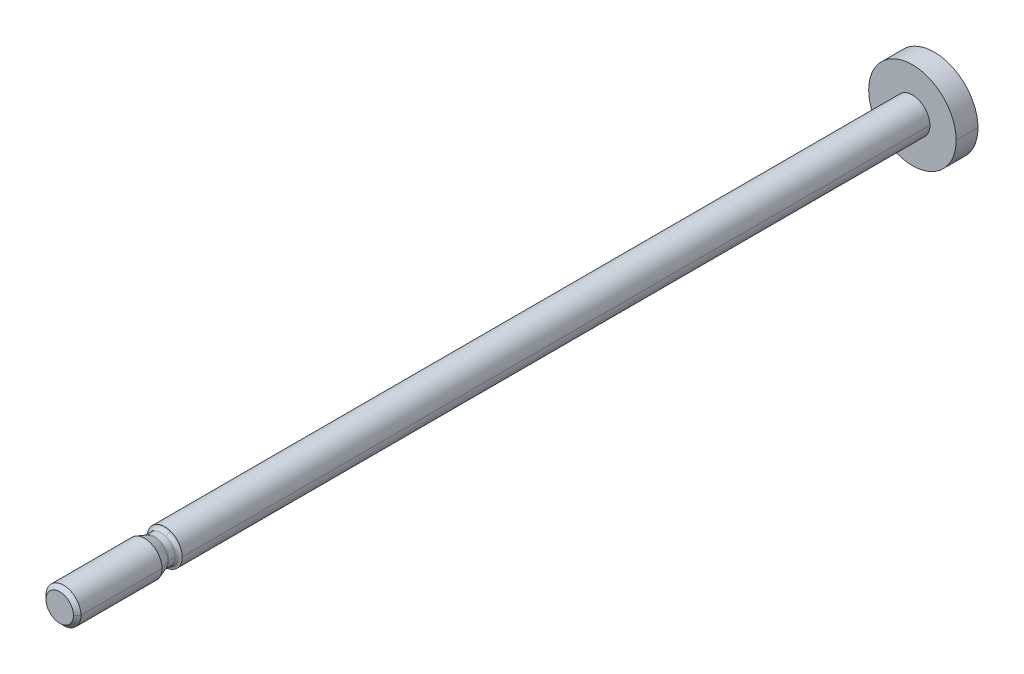
ISO-10303-21;
HEADER;
FILE_DESCRIPTION(('STEP AP214'),'2;1');
FILE_NAME('part.step','',(''),(''),'','','');
FILE_SCHEMA(('AUTOMOTIVE_DESIGN { 1 0 10303 214 1 1 1 1 }'));
ENDSEC;
DATA;
#1=APPLICATION_CONTEXT('core data for automotive mechanical design processes');
#2=APPLICATION_PROTOCOL_DEFINITION('international standard','automotive_design',2000,#1);
#3=PRODUCT_CONTEXT('',#1,'mechanical');
#4=PRODUCT('Part','Part','',(#3));
#5=PRODUCT_RELATED_PRODUCT_CATEGORY('part','',(#4));
#6=PRODUCT_DEFINITION_FORMATION('','',#4);
#7=PRODUCT_DEFINITION_CONTEXT('part definition',#1,'design');
#8=PRODUCT_DEFINITION('design','',#6,#7);
#9=PRODUCT_DEFINITION_SHAPE('','',#8);
#10=(LENGTH_UNIT() NAMED_UNIT(*) SI_UNIT(.MILLI.,.METRE.));
#11=(NAMED_UNIT(*) PLANE_ANGLE_UNIT() SI_UNIT($,.RADIAN.));
#12=(NAMED_UNIT(*) SI_UNIT($,.STERADIAN.) SOLID_ANGLE_UNIT());
#13=UNCERTAINTY_MEASURE_WITH_UNIT(LENGTH_MEASURE(1.E-05),#10,'distance_accuracy_value','');
#14=(GEOMETRIC_REPRESENTATION_CONTEXT(3) GLOBAL_UNCERTAINTY_ASSIGNED_CONTEXT((#13)) GLOBAL_UNIT_ASSIGNED_CONTEXT((#10,
#11,#12)) REPRESENTATION_CONTEXT('',''));
#15=CARTESIAN_POINT('',(0.,0.,0.));
#16=DIRECTION('',(0.,0.,1.));
#17=DIRECTION('',(1.,0.,0.));
#18=AXIS2_PLACEMENT_3D('',#15,#16,#17);
#19=CARTESIAN_POINT('',(0.,0.,-84.));
#20=DIRECTION('',(0.,0.,-1.));
#21=DIRECTION('',(0.,1.,0.));
#22=AXIS2_PLACEMENT_3D('',#19,#20,#21);
#23=CYLINDRICAL_SURFACE('',#22,2.);
#24=DIRECTION('',(0.,0.,-1.));
#25=VECTOR('',#24,1.);
#26=CARTESIAN_POINT('',(2.,0.,4.));
#27=LINE('',#26,#25);
#28=CARTESIAN_POINT('',(2.,0.,4.));
#29=VERTEX_POINT('',#28);
#30=CARTESIAN_POINT('',(2.,0.,-81.5));
#31=VERTEX_POINT('',#30);
#32=EDGE_CURVE('E11',#29,#31,#27,.T.);
#33=ORIENTED_EDGE('',*,*,#32,.F.);
#34=CARTESIAN_POINT('',(0.,0.,4.));
#35=DIRECTION('',(0.,0.,-1.));
#36=DIRECTION('',(-1.,0.,0.));
#37=AXIS2_PLACEMENT_3D('',#34,#35,#36);
#38=CIRCLE('',#37,2.);
#39=CARTESIAN_POINT('',(-0.618033988749915,-1.90211303259037,4.));
#40=VERTEX_POINT('',#39);
#41=EDGE_CURVE('E24',#29,#40,#38,.T.);
#42=ORIENTED_EDGE('',*,*,#41,.T.);
#43=CARTESIAN_POINT('',(0.,0.,4.));
#44=DIRECTION('',(0.,0.,-1.));
#45=DIRECTION('',(-1.,0.,0.));
#46=AXIS2_PLACEMENT_3D('',#43,#44,#45);
#47=CIRCLE('',#46,2.);
#48=CARTESIAN_POINT('',(-2.,0.,4.));
#49=VERTEX_POINT('',#48);
#50=EDGE_CURVE('E306',#40,#49,#47,.T.);
#51=ORIENTED_EDGE('',*,*,#50,.T.);
#52=DIRECTION('',(0.,0.,-1.));
#53=VECTOR('',#52,1.);
#54=CARTESIAN_POINT('',(-2.,0.,4.));
#55=LINE('',#54,#53);
#56=CARTESIAN_POINT('',(-2.,0.,-81.5));
#57=VERTEX_POINT('',#56);
#58=EDGE_CURVE('E302',#49,#57,#55,.T.);
#59=ORIENTED_EDGE('',*,*,#58,.T.);
#60=CARTESIAN_POINT('',(0.,0.,-81.5));
#61=DIRECTION('',(0.,0.,-1.));
#62=DIRECTION('',(-1.,0.,0.));
#63=AXIS2_PLACEMENT_3D('',#60,#61,#62);
#64=CIRCLE('',#63,2.);
#65=EDGE_CURVE('E297',#31,#57,#64,.T.);
#66=ORIENTED_EDGE('',*,*,#65,.F.);
#67=EDGE_LOOP('',(#33,#42,#51,#59,#66));
#68=FACE_BOUND('',#67,.T.);
#69=ADVANCED_FACE('F16',(#68),#23,.T.);
#70=CARTESIAN_POINT('',(0.,2.,-81.5));
#71=DIRECTION('',(0.,0.,-1.));
#72=DIRECTION('',(-1.,0.,0.));
#73=AXIS2_PLACEMENT_3D('',#70,#71,#72);
#74=PLANE('',#73);
#75=CARTESIAN_POINT('',(0.,0.,-81.5));
#76=DIRECTION('',(0.,0.,-1.));
#77=DIRECTION('',(-1.,0.,0.));
#78=AXIS2_PLACEMENT_3D('',#75,#76,#77);
#79=CIRCLE('',#78,5.);
#80=CARTESIAN_POINT('',(5.,0.,-81.5));
#81=VERTEX_POINT('',#80);
#82=CARTESIAN_POINT('',(-5.,0.,-81.5));
#83=VERTEX_POINT('',#82);
#84=EDGE_CURVE('E128',#81,#83,#79,.T.);
#85=ORIENTED_EDGE('',*,*,#84,.F.);
#86=CARTESIAN_POINT('',(0.,0.,-81.5));
#87=DIRECTION('',(0.,0.,-1.));
#88=DIRECTION('',(-1.,0.,0.));
#89=AXIS2_PLACEMENT_3D('',#86,#87,#88);
#90=CIRCLE('',#89,5.);
#91=EDGE_CURVE('E290',#83,#81,#90,.T.);
#92=ORIENTED_EDGE('',*,*,#91,.F.);
#93=EDGE_LOOP('',(#85,#92));
#94=FACE_BOUND('',#93,.T.);
#95=CARTESIAN_POINT('',(0.,0.,-81.5));
#96=DIRECTION('',(0.,0.,-1.));
#97=DIRECTION('',(-1.,0.,0.));
#98=AXIS2_PLACEMENT_3D('',#95,#96,#97);
#99=CIRCLE('',#98,2.);
#100=EDGE_CURVE('E285',#57,#31,#99,.T.);
#101=ORIENTED_EDGE('',*,*,#100,.T.);
#102=ORIENTED_EDGE('',*,*,#65,.T.);
#103=EDGE_LOOP('',(#101,#102));
#104=FACE_BOUND('',#103,.T.);
#105=ADVANCED_FACE('F325',(#94,#104),#74,.F.);
#106=CARTESIAN_POINT('',(0.,0.,-84.));
#107=DIRECTION('',(0.,0.,-1.));
#108=DIRECTION('',(0.,-1.,0.));
#109=AXIS2_PLACEMENT_3D('',#106,#107,#108);
#110=CYLINDRICAL_SURFACE('',#109,2.);
#111=ORIENTED_EDGE('',*,*,#32,.T.);
#112=ORIENTED_EDGE('',*,*,#100,.F.);
#113=ORIENTED_EDGE('',*,*,#58,.F.);
#114=CARTESIAN_POINT('',(0.,0.,4.));
#115=DIRECTION('',(0.,0.,-1.));
#116=DIRECTION('',(-1.,0.,0.));
#117=AXIS2_PLACEMENT_3D('',#114,#115,#116);
#118=CIRCLE('',#117,2.);
#119=CARTESIAN_POINT('',(0.618033988749915,1.90211303259037,4.));
#120=VERTEX_POINT('',#119);
#121=EDGE_CURVE('E281',#49,#120,#118,.T.);
#122=ORIENTED_EDGE('',*,*,#121,.T.);
#123=CARTESIAN_POINT('',(0.,0.,4.));
#124=DIRECTION('',(0.,0.,-1.));
#125=DIRECTION('',(-1.,0.,0.));
#126=AXIS2_PLACEMENT_3D('',#123,#124,#125);
#127=CIRCLE('',#126,2.);
#128=EDGE_CURVE('E277',#120,#29,#127,.T.);
#129=ORIENTED_EDGE('',*,*,#128,.T.);
#130=EDGE_LOOP('',(#111,#112,#113,#122,#129));
#131=FACE_BOUND('',#130,.T.);
#132=ADVANCED_FACE('F323',(#131),#110,.T.);
#133=CARTESIAN_POINT('',(0.,0.,4.40000000000007));
#134=DIRECTION('',(0.,0.,-1.));
#135=DIRECTION('',(-0.951056516295154,0.309016994374947,0.));
#136=AXIS2_PLACEMENT_3D('',#133,#134,#135);
#137=TOROIDAL_SURFACE('',#136,2.00000000000007,0.400000000000064);
#138=CARTESIAN_POINT('',(-0.618033988749915,-1.90211303259037,4.40000000000007));
#139=DIRECTION('',(-0.951056516295154,0.309016994374947,0.));
#140=DIRECTION('',(0.309016994374947,0.951056516295154,-1.64313007644497E-13));
#141=AXIS2_PLACEMENT_3D('',#138,#139,#140);
#142=CIRCLE('',#141,0.400000000000064);
#143=CARTESIAN_POINT('',(-0.494427190999916,-1.52169042607225,4.4));
#144=VERTEX_POINT('',#143);
#145=EDGE_CURVE('E273',#144,#40,#142,.T.);
#146=ORIENTED_EDGE('',*,*,#145,.T.);
#147=ORIENTED_EDGE('',*,*,#41,.F.);
#148=ORIENTED_EDGE('',*,*,#128,.F.);
#149=CARTESIAN_POINT('',(0.618033988749915,1.90211303259037,4.40000000000007));
#150=DIRECTION('',(0.951056516295154,-0.309016994374947,0.));
#151=DIRECTION('',(-0.309016994374947,-0.951056516295154,-1.64313007644497E-13));
#152=AXIS2_PLACEMENT_3D('',#149,#150,#151);
#153=CIRCLE('',#152,0.400000000000064);
#154=CARTESIAN_POINT('',(0.494427190999916,1.52169042607225,4.4));
#155=VERTEX_POINT('',#154);
#156=EDGE_CURVE('E268',#155,#120,#153,.T.);
#157=ORIENTED_EDGE('',*,*,#156,.F.);
#158=CARTESIAN_POINT('',(0.,0.,4.4));
#159=DIRECTION('',(0.,0.,-1.));
#160=DIRECTION('',(-1.,0.,0.));
#161=AXIS2_PLACEMENT_3D('',#158,#159,#160);
#162=CIRCLE('',#161,1.6);
#163=CARTESIAN_POINT('',(1.6,0.,4.4));
#164=VERTEX_POINT('',#163);
#165=EDGE_CURVE('E264',#155,#164,#162,.T.);
#166=ORIENTED_EDGE('',*,*,#165,.T.);
#167=CARTESIAN_POINT('',(0.,0.,4.4));
#168=DIRECTION('',(0.,0.,-1.));
#169=DIRECTION('',(-1.,0.,0.));
#170=AXIS2_PLACEMENT_3D('',#167,#168,#169);
#171=CIRCLE('',#170,1.6);
#172=EDGE_CURVE('E260',#164,#144,#171,.T.);
#173=ORIENTED_EDGE('',*,*,#172,.T.);
#174=EDGE_LOOP('',(#146,#147,#148,#157,#166,#173));
#175=FACE_BOUND('',#174,.T.);
#176=ADVANCED_FACE('F333',(#175),#137,.F.);
#177=CARTESIAN_POINT('',(0.,0.,3.));
#178=DIRECTION('',(0.,0.,-1.));
#179=DIRECTION('',(0.,1.,0.));
#180=AXIS2_PLACEMENT_3D('',#177,#178,#179);
#181=CYLINDRICAL_SURFACE('',#180,1.6);
#182=DIRECTION('',(0.,0.,-1.));
#183=VECTOR('',#182,1.);
#184=CARTESIAN_POINT('',(1.6,0.,5.1294692077166));
#185=LINE('',#184,#183);
#186=CARTESIAN_POINT('',(1.6,0.,5.1294692077166));
#187=VERTEX_POINT('',#186);
#188=EDGE_CURVE('E255',#187,#164,#185,.T.);
#189=ORIENTED_EDGE('',*,*,#188,.F.);
#190=CARTESIAN_POINT('',(0.,0.,5.1294692077166));
#191=DIRECTION('',(0.,0.,-1.));
#192=DIRECTION('',(-1.,0.,0.));
#193=AXIS2_PLACEMENT_3D('',#190,#191,#192);
#194=CIRCLE('',#193,1.6);
#195=CARTESIAN_POINT('',(-0.494427190999915,-1.52169042607224,5.1294692077166));
#196=VERTEX_POINT('',#195);
#197=EDGE_CURVE('E251',#187,#196,#194,.T.);
#198=ORIENTED_EDGE('',*,*,#197,.T.);
#199=CARTESIAN_POINT('',(0.,0.,5.1294692077166));
#200=DIRECTION('',(0.,0.,-1.));
#201=DIRECTION('',(-1.,0.,0.));
#202=AXIS2_PLACEMENT_3D('',#199,#200,#201);
#203=CIRCLE('',#202,1.6);
#204=CARTESIAN_POINT('',(-1.6,0.,5.1294692077166));
#205=VERTEX_POINT('',#204);
#206=EDGE_CURVE('E247',#196,#205,#203,.T.);
#207=ORIENTED_EDGE('',*,*,#206,.T.);
#208=DIRECTION('',(0.,0.,-1.));
#209=VECTOR('',#208,1.);
#210=CARTESIAN_POINT('',(-1.6,0.,5.1294692077166));
#211=LINE('',#210,#209);
#212=CARTESIAN_POINT('',(-1.6,0.,4.4));
#213=VERTEX_POINT('',#212);
#214=EDGE_CURVE('E243',#205,#213,#211,.T.);
#215=ORIENTED_EDGE('',*,*,#214,.T.);
#216=CARTESIAN_POINT('',(0.,0.,4.4));
#217=DIRECTION('',(0.,0.,-1.));
#218=DIRECTION('',(-1.,0.,0.));
#219=AXIS2_PLACEMENT_3D('',#216,#217,#218);
#220=CIRCLE('',#219,1.6);
#221=EDGE_CURVE('E238',#144,#213,#220,.T.);
#222=ORIENTED_EDGE('',*,*,#221,.F.);
#223=ORIENTED_EDGE('',*,*,#172,.F.);
#224=EDGE_LOOP('',(#189,#198,#207,#215,#222,#223));
#225=FACE_BOUND('',#224,.T.);
#226=ADVANCED_FACE('F338',(#225),#181,.T.);
#227=CARTESIAN_POINT('',(0.,0.,4.40000000000007));
#228=DIRECTION('',(0.,0.,-1.));
#229=DIRECTION('',(0.951056516295154,-0.309016994374947,0.));
#230=AXIS2_PLACEMENT_3D('',#227,#228,#229);
#231=TOROIDAL_SURFACE('',#230,2.00000000000007,0.400000000000064);
#232=ORIENTED_EDGE('',*,*,#145,.F.);
#233=ORIENTED_EDGE('',*,*,#221,.T.);
#234=CARTESIAN_POINT('',(0.,0.,4.4));
#235=DIRECTION('',(0.,0.,-1.));
#236=DIRECTION('',(-1.,0.,0.));
#237=AXIS2_PLACEMENT_3D('',#234,#235,#236);
#238=CIRCLE('',#237,1.6);
#239=EDGE_CURVE('E233',#213,#155,#238,.T.);
#240=ORIENTED_EDGE('',*,*,#239,.T.);
#241=ORIENTED_EDGE('',*,*,#156,.T.);
#242=ORIENTED_EDGE('',*,*,#121,.F.);
#243=ORIENTED_EDGE('',*,*,#50,.F.);
#244=EDGE_LOOP('',(#232,#233,#240,#241,#242,#243));
#245=FACE_BOUND('',#244,.T.);
#246=ADVANCED_FACE('F320',(#245),#231,.F.);
#247=CARTESIAN_POINT('',(0.,0.,3.));
#248=DIRECTION('',(0.,0.,-1.));
#249=DIRECTION('',(0.,-1.,0.));
#250=AXIS2_PLACEMENT_3D('',#247,#248,#249);
#251=CYLINDRICAL_SURFACE('',#250,1.6);
#252=ORIENTED_EDGE('',*,*,#188,.T.);
#253=ORIENTED_EDGE('',*,*,#165,.F.);
#254=ORIENTED_EDGE('',*,*,#239,.F.);
#255=ORIENTED_EDGE('',*,*,#214,.F.);
#256=CARTESIAN_POINT('',(0.,0.,5.1294692077166));
#257=DIRECTION('',(0.,0.,-1.));
#258=DIRECTION('',(-1.,0.,0.));
#259=AXIS2_PLACEMENT_3D('',#256,#257,#258);
#260=CIRCLE('',#259,1.6);
#261=CARTESIAN_POINT('',(0.494427190999915,1.52169042607224,5.1294692077166));
#262=VERTEX_POINT('',#261);
#263=EDGE_CURVE('E229',#205,#262,#260,.T.);
#264=ORIENTED_EDGE('',*,*,#263,.T.);
#265=CARTESIAN_POINT('',(0.,0.,5.1294692077166));
#266=DIRECTION('',(0.,0.,-1.));
#267=DIRECTION('',(-1.,0.,0.));
#268=AXIS2_PLACEMENT_3D('',#265,#266,#267);
#269=CIRCLE('',#268,1.6);
#270=EDGE_CURVE('E224',#262,#187,#269,.T.);
#271=ORIENTED_EDGE('',*,*,#270,.T.);
#272=EDGE_LOOP('',(#252,#253,#254,#255,#264,#271));
#273=FACE_BOUND('',#272,.T.);
#274=ADVANCED_FACE('F345',(#273),#251,.T.);
#275=CARTESIAN_POINT('',(0.,0.,5.12946920771672));
#276=DIRECTION('',(0.,0.,-1.));
#277=DIRECTION('',(-0.951056516295154,0.309016994374947,0.));
#278=AXIS2_PLACEMENT_3D('',#275,#276,#277);
#279=TOROIDAL_SURFACE('',#278,2.0000000000001,0.400000000000107);
#280=CARTESIAN_POINT('',(-0.618033988749927,-1.90211303259041,5.12946920771672));
#281=DIRECTION('',(-0.951056516295154,0.309016994374947,0.));
#282=DIRECTION('',(0.290380989311613,0.893700790313016,0.342020143325361));
#283=AXIS2_PLACEMENT_3D('',#280,#281,#282);
#284=CIRCLE('',#283,0.400000000000107);
#285=CARTESIAN_POINT('',(-0.50188159302525,-1.54463271646511,5.2662772650469));
#286=VERTEX_POINT('',#285);
#287=EDGE_CURVE('E219',#286,#196,#284,.T.);
#288=ORIENTED_EDGE('',*,*,#287,.T.);
#289=ORIENTED_EDGE('',*,*,#197,.F.);
#290=ORIENTED_EDGE('',*,*,#270,.F.);
#291=CARTESIAN_POINT('',(0.618033988749927,1.90211303259041,5.12946920771672));
#292=DIRECTION('',(0.951056516295154,-0.309016994374948,0.));
#293=DIRECTION('',(-0.290380989311613,-0.893700790313016,0.342020143325361));
#294=AXIS2_PLACEMENT_3D('',#291,#292,#293);
#295=CIRCLE('',#294,0.400000000000107);
#296=CARTESIAN_POINT('',(0.501881593025251,1.54463271646511,5.2662772650469));
#297=VERTEX_POINT('',#296);
#298=EDGE_CURVE('E214',#297,#262,#295,.T.);
#299=ORIENTED_EDGE('',*,*,#298,.F.);
#300=CARTESIAN_POINT('',(0.,0.,5.2662772650469));
#301=DIRECTION('',(0.,0.,-1.));
#302=DIRECTION('',(-1.,0.,0.));
#303=AXIS2_PLACEMENT_3D('',#300,#301,#302);
#304=CIRCLE('',#303,1.6241229516856);
#305=CARTESIAN_POINT('',(1.6241229516856,0.,5.2662772650469));
#306=VERTEX_POINT('',#305);
#307=EDGE_CURVE('E210',#297,#306,#304,.T.);
#308=ORIENTED_EDGE('',*,*,#307,.T.);
#309=CARTESIAN_POINT('',(0.,0.,5.2662772650469));
#310=DIRECTION('',(0.,0.,-1.));
#311=DIRECTION('',(-1.,0.,0.));
#312=AXIS2_PLACEMENT_3D('',#309,#310,#311);
#313=CIRCLE('',#312,1.6241229516856);
#314=EDGE_CURVE('E206',#306,#286,#313,.T.);
#315=ORIENTED_EDGE('',*,*,#314,.T.);
#316=EDGE_LOOP('',(#288,#289,#290,#299,#308,#315));
#317=FACE_BOUND('',#316,.T.);
#318=ADVANCED_FACE('F348',(#317),#279,.F.);
#319=CARTESIAN_POINT('',(0.,0.,6.2989909677818));
#320=DIRECTION('',(0.,0.,1.));
#321=DIRECTION('',(0.,1.,0.));
#322=AXIS2_PLACEMENT_3D('',#319,#320,#321);
#323=CONICAL_SURFACE('',#322,2.,0.349065850398918);
#324=DIRECTION('',(-0.342020143325717,0.,0.939692620785891));
#325=VECTOR('',#324,1.);
#326=CARTESIAN_POINT('',(-1.6241229516856,0.,5.2662772650469));
#327=LINE('',#326,#325);
#328=CARTESIAN_POINT('',(-1.6241229516856,0.,5.2662772650469));
#329=VERTEX_POINT('',#328);
#330=CARTESIAN_POINT('',(-2.,0.,6.2989909677818));
#331=VERTEX_POINT('',#330);
#332=EDGE_CURVE('E201',#329,#331,#327,.T.);
#333=ORIENTED_EDGE('',*,*,#332,.F.);
#334=CARTESIAN_POINT('',(0.,0.,5.2662772650469));
#335=DIRECTION('',(0.,0.,-1.));
#336=DIRECTION('',(-1.,0.,0.));
#337=AXIS2_PLACEMENT_3D('',#334,#335,#336);
#338=CIRCLE('',#337,1.6241229516856);
#339=EDGE_CURVE('E196',#286,#329,#338,.T.);
#340=ORIENTED_EDGE('',*,*,#339,.F.);
#341=ORIENTED_EDGE('',*,*,#314,.F.);
#342=DIRECTION('',(0.342020143325717,0.,0.939692620785891));
#343=VECTOR('',#342,1.);
#344=CARTESIAN_POINT('',(1.6241229516856,0.,5.2662772650469));
#345=LINE('',#344,#343);
#346=CARTESIAN_POINT('',(2.,0.,6.2989909677818));
#347=VERTEX_POINT('',#346);
#348=EDGE_CURVE('E192',#306,#347,#345,.T.);
#349=ORIENTED_EDGE('',*,*,#348,.T.);
#350=CARTESIAN_POINT('',(0.,0.,6.2989909677818));
#351=DIRECTION('',(0.,0.,-1.));
#352=DIRECTION('',(-1.,0.,0.));
#353=AXIS2_PLACEMENT_3D('',#350,#351,#352);
#354=CIRCLE('',#353,2.);
#355=EDGE_CURVE('E188',#347,#331,#354,.T.);
#356=ORIENTED_EDGE('',*,*,#355,.T.);
#357=EDGE_LOOP('',(#333,#340,#341,#349,#356));
#358=FACE_BOUND('',#357,.T.);
#359=ADVANCED_FACE('F352',(#358),#323,.T.);
#360=CARTESIAN_POINT('',(0.,0.,3.));
#361=DIRECTION('',(0.,0.,-1.));
#362=DIRECTION('',(0.,1.,0.));
#363=AXIS2_PLACEMENT_3D('',#360,#361,#362);
#364=CYLINDRICAL_SURFACE('',#363,2.);
#365=DIRECTION('',(0.,0.,-1.));
#366=VECTOR('',#365,1.);
#367=CARTESIAN_POINT('',(2.,0.,15.5705));
#368=LINE('',#367,#366);
#369=CARTESIAN_POINT('',(2.,0.,15.5705));
#370=VERTEX_POINT('',#369);
#371=EDGE_CURVE('E183',#370,#347,#368,.T.);
#372=ORIENTED_EDGE('',*,*,#371,.F.);
#373=CARTESIAN_POINT('',(0.,0.,15.5705));
#374=DIRECTION('',(0.,0.,-1.));
#375=DIRECTION('',(-1.,0.,0.));
#376=AXIS2_PLACEMENT_3D('',#373,#374,#375);
#377=CIRCLE('',#376,2.);
#378=CARTESIAN_POINT('',(-2.,0.,15.5705));
#379=VERTEX_POINT('',#378);
#380=EDGE_CURVE('E179',#370,#379,#377,.T.);
#381=ORIENTED_EDGE('',*,*,#380,.T.);
#382=DIRECTION('',(0.,0.,-1.));
#383=VECTOR('',#382,1.);
#384=CARTESIAN_POINT('',(-2.,0.,15.5705));
#385=LINE('',#384,#383);
#386=EDGE_CURVE('E174',#379,#331,#385,.T.);
#387=ORIENTED_EDGE('',*,*,#386,.T.);
#388=ORIENTED_EDGE('',*,*,#355,.F.);
#389=EDGE_LOOP('',(#372,#381,#387,#388));
#390=FACE_BOUND('',#389,.T.);
#391=ADVANCED_FACE('F356',(#390),#364,.T.);
#392=CARTESIAN_POINT('',(0.,0.,3.));
#393=DIRECTION('',(0.,0.,-1.));
#394=DIRECTION('',(0.,-1.,0.));
#395=AXIS2_PLACEMENT_3D('',#392,#393,#394);
#396=CYLINDRICAL_SURFACE('',#395,2.);
#397=ORIENTED_EDGE('',*,*,#371,.T.);
#398=CARTESIAN_POINT('',(0.,0.,6.2989909677818));
#399=DIRECTION('',(0.,0.,-1.));
#400=DIRECTION('',(-1.,0.,0.));
#401=AXIS2_PLACEMENT_3D('',#398,#399,#400);
#402=CIRCLE('',#401,2.);
#403=EDGE_CURVE('E169',#331,#347,#402,.T.);
#404=ORIENTED_EDGE('',*,*,#403,.F.);
#405=ORIENTED_EDGE('',*,*,#386,.F.);
#406=CARTESIAN_POINT('',(0.,0.,15.5705));
#407=DIRECTION('',(0.,0.,-1.));
#408=DIRECTION('',(-1.,0.,0.));
#409=AXIS2_PLACEMENT_3D('',#406,#407,#408);
#410=CIRCLE('',#409,2.);
#411=EDGE_CURVE('E164',#379,#370,#410,.T.);
#412=ORIENTED_EDGE('',*,*,#411,.T.);
#413=EDGE_LOOP('',(#397,#404,#405,#412));
#414=FACE_BOUND('',#413,.T.);
#415=ADVANCED_FACE('F360',(#414),#396,.T.);
#416=CARTESIAN_POINT('',(0.,0.,16.));
#417=DIRECTION('',(0.,0.,-1.));
#418=DIRECTION('',(0.,-1.,0.));
#419=AXIS2_PLACEMENT_3D('',#416,#417,#418);
#420=CONICAL_SURFACE('',#419,1.5705,0.785398163397445);
#421=DIRECTION('',(0.707106781186545,0.,-0.70710678118655));
#422=VECTOR('',#421,1.);
#423=CARTESIAN_POINT('',(1.5705,0.,16.));
#424=LINE('',#423,#422);
#425=CARTESIAN_POINT('',(1.5705,0.,16.));
#426=VERTEX_POINT('',#425);
#427=EDGE_CURVE('E159',#426,#370,#424,.T.);
#428=ORIENTED_EDGE('',*,*,#427,.T.);
#429=ORIENTED_EDGE('',*,*,#411,.F.);
#430=DIRECTION('',(-0.707106781186545,0.,-0.70710678118655));
#431=VECTOR('',#430,1.);
#432=CARTESIAN_POINT('',(-1.5705,0.,16.));
#433=LINE('',#432,#431);
#434=CARTESIAN_POINT('',(-1.5705,0.,16.));
#435=VERTEX_POINT('',#434);
#436=EDGE_CURVE('E154',#435,#379,#433,.T.);
#437=ORIENTED_EDGE('',*,*,#436,.F.);
#438=CARTESIAN_POINT('',(0.,0.,16.));
#439=DIRECTION('',(0.,0.,-1.));
#440=DIRECTION('',(-1.,0.,0.));
#441=AXIS2_PLACEMENT_3D('',#438,#439,#440);
#442=CIRCLE('',#441,1.5705);
#443=EDGE_CURVE('E150',#435,#426,#442,.T.);
#444=ORIENTED_EDGE('',*,*,#443,.T.);
#445=EDGE_LOOP('',(#428,#429,#437,#444));
#446=FACE_BOUND('',#445,.T.);
#447=ADVANCED_FACE('F364',(#446),#420,.T.);
#448=CARTESIAN_POINT('',(0.,0.,16.));
#449=DIRECTION('',(0.,0.,-1.));
#450=DIRECTION('',(-1.,0.,0.));
#451=AXIS2_PLACEMENT_3D('',#448,#449,#450);
#452=PLANE('',#451);
#453=CARTESIAN_POINT('',(0.,0.,16.));
#454=DIRECTION('',(0.,0.,-1.));
#455=DIRECTION('',(-1.,0.,0.));
#456=AXIS2_PLACEMENT_3D('',#453,#454,#455);
#457=CIRCLE('',#456,1.5705);
#458=EDGE_CURVE('E145',#426,#435,#457,.T.);
#459=ORIENTED_EDGE('',*,*,#458,.F.);
#460=ORIENTED_EDGE('',*,*,#443,.F.);
#461=EDGE_LOOP('',(#459,#460));
#462=FACE_BOUND('',#461,.T.);
#463=ADVANCED_FACE('F368',(#462),#452,.F.);
#464=CARTESIAN_POINT('',(0.,0.,16.));
#465=DIRECTION('',(0.,0.,-1.));
#466=DIRECTION('',(0.,1.,0.));
#467=AXIS2_PLACEMENT_3D('',#464,#465,#466);
#468=CONICAL_SURFACE('',#467,1.5705,0.785398163397445);
#469=ORIENTED_EDGE('',*,*,#427,.F.);
#470=ORIENTED_EDGE('',*,*,#458,.T.);
#471=ORIENTED_EDGE('',*,*,#436,.T.);
#472=ORIENTED_EDGE('',*,*,#380,.F.);
#473=EDGE_LOOP('',(#469,#470,#471,#472));
#474=FACE_BOUND('',#473,.T.);
#475=ADVANCED_FACE('F372',(#474),#468,.T.);
#476=CARTESIAN_POINT('',(0.,0.,6.2989909677818));
#477=DIRECTION('',(0.,0.,1.));
#478=DIRECTION('',(0.,-1.,0.));
#479=AXIS2_PLACEMENT_3D('',#476,#477,#478);
#480=CONICAL_SURFACE('',#479,2.,0.349065850398918);
#481=ORIENTED_EDGE('',*,*,#332,.T.);
#482=ORIENTED_EDGE('',*,*,#403,.T.);
#483=ORIENTED_EDGE('',*,*,#348,.F.);
#484=ORIENTED_EDGE('',*,*,#307,.F.);
#485=CARTESIAN_POINT('',(0.,0.,5.2662772650469));
#486=DIRECTION('',(0.,0.,-1.));
#487=DIRECTION('',(-1.,0.,0.));
#488=AXIS2_PLACEMENT_3D('',#485,#486,#487);
#489=CIRCLE('',#488,1.6241229516856);
#490=EDGE_CURVE('E140',#329,#297,#489,.T.);
#491=ORIENTED_EDGE('',*,*,#490,.F.);
#492=EDGE_LOOP('',(#481,#482,#483,#484,#491));
#493=FACE_BOUND('',#492,.T.);
#494=ADVANCED_FACE('F376',(#493),#480,.T.);
#495=CARTESIAN_POINT('',(0.,0.,5.12946920771672));
#496=DIRECTION('',(0.,0.,-1.));
#497=DIRECTION('',(0.951056516295154,-0.309016994374947,0.));
#498=AXIS2_PLACEMENT_3D('',#495,#496,#497);
#499=TOROIDAL_SURFACE('',#498,2.0000000000001,0.400000000000107);
#500=ORIENTED_EDGE('',*,*,#287,.F.);
#501=ORIENTED_EDGE('',*,*,#339,.T.);
#502=ORIENTED_EDGE('',*,*,#490,.T.);
#503=ORIENTED_EDGE('',*,*,#298,.T.);
#504=ORIENTED_EDGE('',*,*,#263,.F.);
#505=ORIENTED_EDGE('',*,*,#206,.F.);
#506=EDGE_LOOP('',(#500,#501,#502,#503,#504,#505));
#507=FACE_BOUND('',#506,.T.);
#508=ADVANCED_FACE('F380',(#507),#499,.F.);
#509=CARTESIAN_POINT('',(0.,0.,-84.));
#510=DIRECTION('',(0.,0.,-1.));
#511=DIRECTION('',(0.,-1.,0.));
#512=AXIS2_PLACEMENT_3D('',#509,#510,#511);
#513=CYLINDRICAL_SURFACE('',#512,5.);
#514=DIRECTION('',(0.,0.,-1.));
#515=VECTOR('',#514,1.);
#516=CARTESIAN_POINT('',(5.,0.,-81.5));
#517=LINE('',#516,#515);
#518=CARTESIAN_POINT('',(5.,0.,-84.));
#519=VERTEX_POINT('',#518);
#520=EDGE_CURVE('E120',#81,#519,#517,.T.);
#521=ORIENTED_EDGE('',*,*,#520,.T.);
#522=CARTESIAN_POINT('',(0.,0.,-84.));
#523=DIRECTION('',(0.,0.,-1.));
#524=DIRECTION('',(-1.,0.,0.));
#525=AXIS2_PLACEMENT_3D('',#522,#523,#524);
#526=CIRCLE('',#525,5.);
#527=CARTESIAN_POINT('',(-5.,0.,-84.));
#528=VERTEX_POINT('',#527);
#529=EDGE_CURVE('E113',#528,#519,#526,.T.);
#530=ORIENTED_EDGE('',*,*,#529,.F.);
#531=DIRECTION('',(0.,0.,-1.));
#532=VECTOR('',#531,1.);
#533=CARTESIAN_POINT('',(-5.,0.,-81.5));
#534=LINE('',#533,#532);
#535=EDGE_CURVE('E117',#83,#528,#534,.T.);
#536=ORIENTED_EDGE('',*,*,#535,.F.);
#537=ORIENTED_EDGE('',*,*,#91,.T.);
#538=EDGE_LOOP('',(#521,#530,#536,#537));
#539=FACE_BOUND('',#538,.T.);
#540=ADVANCED_FACE('F115',(#539),#513,.T.);
#541=CARTESIAN_POINT('',(0.,0.,-84.));
#542=DIRECTION('',(0.,0.,-1.));
#543=DIRECTION('',(0.,1.,0.));
#544=AXIS2_PLACEMENT_3D('',#541,#542,#543);
#545=CYLINDRICAL_SURFACE('',#544,5.);
#546=ORIENTED_EDGE('',*,*,#520,.F.);
#547=ORIENTED_EDGE('',*,*,#84,.T.);
#548=ORIENTED_EDGE('',*,*,#535,.T.);
#549=CARTESIAN_POINT('',(0.,0.,-84.));
#550=DIRECTION('',(0.,0.,-1.));
#551=DIRECTION('',(-1.,0.,0.));
#552=AXIS2_PLACEMENT_3D('',#549,#550,#551);
#553=CIRCLE('',#552,5.);
#554=EDGE_CURVE('E127',#519,#528,#553,.T.);
#555=ORIENTED_EDGE('',*,*,#554,.F.);
#556=EDGE_LOOP('',(#546,#547,#548,#555));
#557=FACE_BOUND('',#556,.T.);
#558=ADVANCED_FACE('F126',(#557),#545,.T.);
#559=CARTESIAN_POINT('',(0.,5.,-84.));
#560=DIRECTION('',(0.,0.,1.));
#561=DIRECTION('',(1.,0.,0.));
#562=AXIS2_PLACEMENT_3D('',#559,#560,#561);
#563=PLANE('',#562);
#564=ORIENTED_EDGE('',*,*,#529,.T.);
#565=ORIENTED_EDGE('',*,*,#554,.T.);
#566=EDGE_LOOP('',(#564,#565));
#567=FACE_BOUND('',#566,.T.);
#568=ADVANCED_FACE('F130',(#567),#563,.F.);
#569=CLOSED_SHELL('',(#69,#105,#132,#176,#226,#246,#274,#318,#359,#391,#415,#447,#463,#475,#494,
#508,#540,#558,#568));
#570=MANIFOLD_SOLID_BREP('B1',#569);
#571=ADVANCED_BREP_SHAPE_REPRESENTATION('',(#18,#570),#14);
#572=SHAPE_DEFINITION_REPRESENTATION(#9,#571);
ENDSEC;
END-ISO-10303-21;
